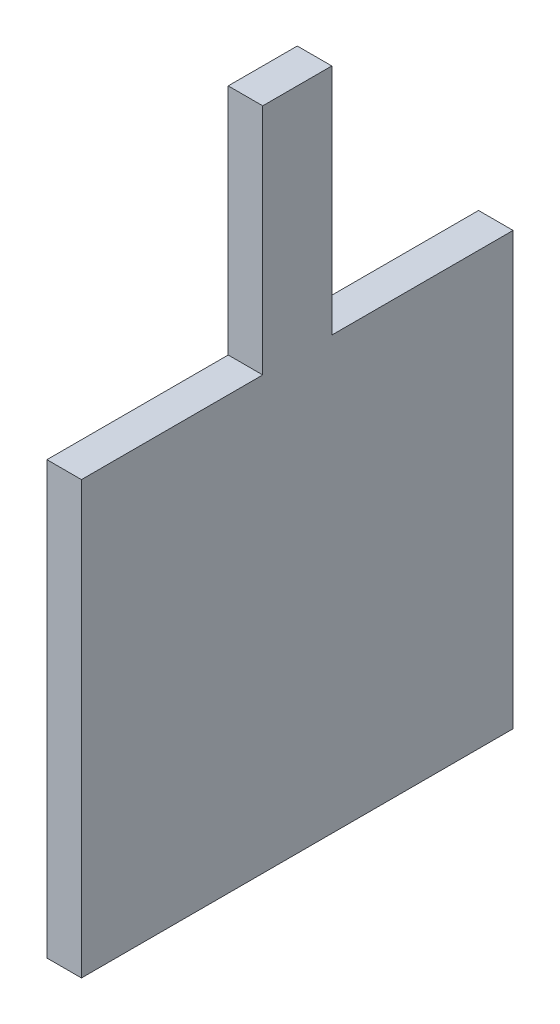
ISO-10303-21;
HEADER;
FILE_DESCRIPTION(('STEP AP214'),'2;1');
FILE_NAME('part.step','',(''),(''),'','','');
FILE_SCHEMA(('AUTOMOTIVE_DESIGN { 1 0 10303 214 1 1 1 1 }'));
ENDSEC;
DATA;
#1=APPLICATION_CONTEXT('core data for automotive mechanical design processes');
#2=APPLICATION_PROTOCOL_DEFINITION('international standard','automotive_design',2000,#1);
#3=PRODUCT_CONTEXT('',#1,'mechanical');
#4=PRODUCT('Part','Part','',(#3));
#5=PRODUCT_RELATED_PRODUCT_CATEGORY('part','',(#4));
#6=PRODUCT_DEFINITION_FORMATION('','',#4);
#7=PRODUCT_DEFINITION_CONTEXT('part definition',#1,'design');
#8=PRODUCT_DEFINITION('design','',#6,#7);
#9=PRODUCT_DEFINITION_SHAPE('','',#8);
#10=(LENGTH_UNIT() NAMED_UNIT(*) SI_UNIT(.MILLI.,.METRE.));
#11=(NAMED_UNIT(*) PLANE_ANGLE_UNIT() SI_UNIT($,.RADIAN.));
#12=(NAMED_UNIT(*) SI_UNIT($,.STERADIAN.) SOLID_ANGLE_UNIT());
#13=UNCERTAINTY_MEASURE_WITH_UNIT(LENGTH_MEASURE(1.E-05),#10,'distance_accuracy_value','');
#14=(GEOMETRIC_REPRESENTATION_CONTEXT(3) GLOBAL_UNCERTAINTY_ASSIGNED_CONTEXT((#13)) GLOBAL_UNIT_ASSIGNED_CONTEXT((#10,
#11,#12)) REPRESENTATION_CONTEXT('',''));
#15=CARTESIAN_POINT('',(0.,0.,0.));
#16=DIRECTION('',(0.,0.,1.));
#17=DIRECTION('',(1.,0.,0.));
#18=AXIS2_PLACEMENT_3D('',#15,#16,#17);
#19=CARTESIAN_POINT('',(4.,0.,21.));
#20=DIRECTION('',(0.,-1.,0.));
#21=DIRECTION('',(0.,0.,-1.));
#22=AXIS2_PLACEMENT_3D('',#19,#20,#21);
#23=PLANE('',#22);
#24=DIRECTION('',(0.,0.,1.));
#25=VECTOR('',#24,1.);
#26=CARTESIAN_POINT('',(0.,0.,21.));
#27=LINE('',#26,#25);
#28=CARTESIAN_POINT('',(0.,0.,0.));
#29=VERTEX_POINT('',#28);
#30=CARTESIAN_POINT('',(0.,0.,21.));
#31=VERTEX_POINT('',#30);
#32=EDGE_CURVE('E129',#29,#31,#27,.T.);
#33=ORIENTED_EDGE('',*,*,#32,.T.);
#34=DIRECTION('',(-1.,0.,0.));
#35=VECTOR('',#34,1.);
#36=CARTESIAN_POINT('',(4.,0.,21.));
#37=LINE('',#36,#35);
#38=CARTESIAN_POINT('',(4.,0.,21.));
#39=VERTEX_POINT('',#38);
#40=EDGE_CURVE('E11',#39,#31,#37,.T.);
#41=ORIENTED_EDGE('',*,*,#40,.F.);
#42=DIRECTION('',(0.,0.,1.));
#43=VECTOR('',#42,1.);
#44=CARTESIAN_POINT('',(4.,0.,21.));
#45=LINE('',#44,#43);
#46=CARTESIAN_POINT('',(4.,0.,0.));
#47=VERTEX_POINT('',#46);
#48=EDGE_CURVE('E143',#47,#39,#45,.T.);
#49=ORIENTED_EDGE('',*,*,#48,.F.);
#50=DIRECTION('',(-1.,0.,0.));
#51=VECTOR('',#50,1.);
#52=CARTESIAN_POINT('',(4.,0.,0.));
#53=LINE('',#52,#51);
#54=EDGE_CURVE('E125',#47,#29,#53,.T.);
#55=ORIENTED_EDGE('',*,*,#54,.T.);
#56=EDGE_LOOP('',(#33,#41,#49,#55));
#57=FACE_BOUND('',#56,.T.);
#58=ADVANCED_FACE('F33',(#57),#23,.F.);
#59=CARTESIAN_POINT('',(4.,-50.,21.));
#60=DIRECTION('',(0.,0.,-1.));
#61=DIRECTION('',(-1.,0.,0.));
#62=AXIS2_PLACEMENT_3D('',#59,#60,#61);
#63=PLANE('',#62);
#64=DIRECTION('',(0.,-1.,0.));
#65=VECTOR('',#64,1.);
#66=CARTESIAN_POINT('',(0.,-50.,21.));
#67=LINE('',#66,#65);
#68=CARTESIAN_POINT('',(0.,-50.,21.));
#69=VERTEX_POINT('',#68);
#70=EDGE_CURVE('E132',#31,#69,#67,.T.);
#71=ORIENTED_EDGE('',*,*,#70,.T.);
#72=DIRECTION('',(-1.,0.,0.));
#73=VECTOR('',#72,1.);
#74=CARTESIAN_POINT('',(4.,-50.,21.));
#75=LINE('',#74,#73);
#76=CARTESIAN_POINT('',(4.,-50.,21.));
#77=VERTEX_POINT('',#76);
#78=EDGE_CURVE('E41',#77,#69,#75,.T.);
#79=ORIENTED_EDGE('',*,*,#78,.F.);
#80=DIRECTION('',(0.,-1.,0.));
#81=VECTOR('',#80,1.);
#82=CARTESIAN_POINT('',(4.,-50.,21.));
#83=LINE('',#82,#81);
#84=EDGE_CURVE('E92',#39,#77,#83,.T.);
#85=ORIENTED_EDGE('',*,*,#84,.F.);
#86=ORIENTED_EDGE('',*,*,#40,.T.);
#87=EDGE_LOOP('',(#71,#79,#85,#86));
#88=FACE_BOUND('',#87,.T.);
#89=ADVANCED_FACE('F178',(#88),#63,.F.);
#90=CARTESIAN_POINT('',(4.,-50.,-29.));
#91=DIRECTION('',(0.,1.,0.));
#92=DIRECTION('',(0.,0.,1.));
#93=AXIS2_PLACEMENT_3D('',#90,#91,#92);
#94=PLANE('',#93);
#95=DIRECTION('',(0.,0.,-1.));
#96=VECTOR('',#95,1.);
#97=CARTESIAN_POINT('',(0.,-50.,-29.));
#98=LINE('',#97,#96);
#99=CARTESIAN_POINT('',(0.,-50.,-29.));
#100=VERTEX_POINT('',#99);
#101=EDGE_CURVE('E134',#69,#100,#98,.T.);
#102=ORIENTED_EDGE('',*,*,#101,.T.);
#103=DIRECTION('',(-1.,0.,0.));
#104=VECTOR('',#103,1.);
#105=CARTESIAN_POINT('',(4.,-50.,-29.));
#106=LINE('',#105,#104);
#107=CARTESIAN_POINT('',(4.,-50.,-29.));
#108=VERTEX_POINT('',#107);
#109=EDGE_CURVE('E150',#108,#100,#106,.T.);
#110=ORIENTED_EDGE('',*,*,#109,.F.);
#111=DIRECTION('',(0.,0.,-1.));
#112=VECTOR('',#111,1.);
#113=CARTESIAN_POINT('',(4.,-50.,-29.));
#114=LINE('',#113,#112);
#115=EDGE_CURVE('E158',#77,#108,#114,.T.);
#116=ORIENTED_EDGE('',*,*,#115,.F.);
#117=ORIENTED_EDGE('',*,*,#78,.T.);
#118=EDGE_LOOP('',(#102,#110,#116,#117));
#119=FACE_BOUND('',#118,.T.);
#120=ADVANCED_FACE('F156',(#119),#94,.F.);
#121=CARTESIAN_POINT('',(4.,0.,-29.));
#122=DIRECTION('',(0.,0.,1.));
#123=DIRECTION('',(0.,-1.,0.));
#124=AXIS2_PLACEMENT_3D('',#121,#122,#123);
#125=PLANE('',#124);
#126=DIRECTION('',(0.,1.,0.));
#127=VECTOR('',#126,1.);
#128=CARTESIAN_POINT('',(0.,0.,-29.));
#129=LINE('',#128,#127);
#130=CARTESIAN_POINT('',(0.,0.,-29.));
#131=VERTEX_POINT('',#130);
#132=EDGE_CURVE('E136',#100,#131,#129,.T.);
#133=ORIENTED_EDGE('',*,*,#132,.T.);
#134=DIRECTION('',(-1.,0.,0.));
#135=VECTOR('',#134,1.);
#136=CARTESIAN_POINT('',(4.,0.,-29.));
#137=LINE('',#136,#135);
#138=CARTESIAN_POINT('',(4.,0.,-29.));
#139=VERTEX_POINT('',#138);
#140=EDGE_CURVE('E147',#139,#131,#137,.T.);
#141=ORIENTED_EDGE('',*,*,#140,.F.);
#142=DIRECTION('',(0.,1.,0.));
#143=VECTOR('',#142,1.);
#144=CARTESIAN_POINT('',(4.,0.,-29.));
#145=LINE('',#144,#143);
#146=EDGE_CURVE('E170',#108,#139,#145,.T.);
#147=ORIENTED_EDGE('',*,*,#146,.F.);
#148=ORIENTED_EDGE('',*,*,#109,.T.);
#149=EDGE_LOOP('',(#133,#141,#147,#148));
#150=FACE_BOUND('',#149,.T.);
#151=ADVANCED_FACE('F166',(#150),#125,.F.);
#152=CARTESIAN_POINT('',(4.,0.,-8.));
#153=DIRECTION('',(0.,-1.,0.));
#154=DIRECTION('',(0.,0.,-1.));
#155=AXIS2_PLACEMENT_3D('',#152,#153,#154);
#156=PLANE('',#155);
#157=DIRECTION('',(0.,0.,1.));
#158=VECTOR('',#157,1.);
#159=CARTESIAN_POINT('',(0.,0.,-8.));
#160=LINE('',#159,#158);
#161=CARTESIAN_POINT('',(0.,0.,-8.));
#162=VERTEX_POINT('',#161);
#163=EDGE_CURVE('E138',#131,#162,#160,.T.);
#164=ORIENTED_EDGE('',*,*,#163,.T.);
#165=DIRECTION('',(-1.,0.,0.));
#166=VECTOR('',#165,1.);
#167=CARTESIAN_POINT('',(4.,0.,-8.));
#168=LINE('',#167,#166);
#169=CARTESIAN_POINT('',(4.,0.,-8.));
#170=VERTEX_POINT('',#169);
#171=EDGE_CURVE('E120',#170,#162,#168,.T.);
#172=ORIENTED_EDGE('',*,*,#171,.F.);
#173=DIRECTION('',(0.,0.,1.));
#174=VECTOR('',#173,1.);
#175=CARTESIAN_POINT('',(4.,0.,-8.));
#176=LINE('',#175,#174);
#177=EDGE_CURVE('E111',#139,#170,#176,.T.);
#178=ORIENTED_EDGE('',*,*,#177,.F.);
#179=ORIENTED_EDGE('',*,*,#140,.T.);
#180=EDGE_LOOP('',(#164,#172,#178,#179));
#181=FACE_BOUND('',#180,.T.);
#182=ADVANCED_FACE('F169',(#181),#156,.F.);
#183=CARTESIAN_POINT('',(4.,27.,-8.));
#184=DIRECTION('',(0.,0.,1.));
#185=DIRECTION('',(0.,-1.,0.));
#186=AXIS2_PLACEMENT_3D('',#183,#184,#185);
#187=PLANE('',#186);
#188=DIRECTION('',(0.,1.,0.));
#189=VECTOR('',#188,1.);
#190=CARTESIAN_POINT('',(0.,27.,-8.));
#191=LINE('',#190,#189);
#192=CARTESIAN_POINT('',(0.,27.,-8.));
#193=VERTEX_POINT('',#192);
#194=EDGE_CURVE('E119',#162,#193,#191,.T.);
#195=ORIENTED_EDGE('',*,*,#194,.T.);
#196=DIRECTION('',(-1.,0.,0.));
#197=VECTOR('',#196,1.);
#198=CARTESIAN_POINT('',(4.,27.,-8.));
#199=LINE('',#198,#197);
#200=CARTESIAN_POINT('',(4.,27.,-8.));
#201=VERTEX_POINT('',#200);
#202=EDGE_CURVE('E116',#201,#193,#199,.T.);
#203=ORIENTED_EDGE('',*,*,#202,.F.);
#204=DIRECTION('',(0.,1.,0.));
#205=VECTOR('',#204,1.);
#206=CARTESIAN_POINT('',(4.,27.,-8.));
#207=LINE('',#206,#205);
#208=EDGE_CURVE('E105',#170,#201,#207,.T.);
#209=ORIENTED_EDGE('',*,*,#208,.F.);
#210=ORIENTED_EDGE('',*,*,#171,.T.);
#211=EDGE_LOOP('',(#195,#203,#209,#210));
#212=FACE_BOUND('',#211,.T.);
#213=ADVANCED_FACE('F117',(#212),#187,.F.);
#214=CARTESIAN_POINT('',(4.,27.,0.));
#215=DIRECTION('',(0.,-1.,0.));
#216=DIRECTION('',(0.,0.,-1.));
#217=AXIS2_PLACEMENT_3D('',#214,#215,#216);
#218=PLANE('',#217);
#219=DIRECTION('',(0.,0.,1.));
#220=VECTOR('',#219,1.);
#221=CARTESIAN_POINT('',(0.,27.,0.));
#222=LINE('',#221,#220);
#223=CARTESIAN_POINT('',(0.,27.,0.));
#224=VERTEX_POINT('',#223);
#225=EDGE_CURVE('E78',#193,#224,#222,.T.);
#226=ORIENTED_EDGE('',*,*,#225,.T.);
#227=DIRECTION('',(-1.,0.,0.));
#228=VECTOR('',#227,1.);
#229=CARTESIAN_POINT('',(4.,27.,0.));
#230=LINE('',#229,#228);
#231=CARTESIAN_POINT('',(4.,27.,0.));
#232=VERTEX_POINT('',#231);
#233=EDGE_CURVE('E121',#232,#224,#230,.T.);
#234=ORIENTED_EDGE('',*,*,#233,.F.);
#235=DIRECTION('',(0.,0.,1.));
#236=VECTOR('',#235,1.);
#237=CARTESIAN_POINT('',(4.,27.,0.));
#238=LINE('',#237,#236);
#239=EDGE_CURVE('E109',#201,#232,#238,.T.);
#240=ORIENTED_EDGE('',*,*,#239,.F.);
#241=ORIENTED_EDGE('',*,*,#202,.T.);
#242=EDGE_LOOP('',(#226,#234,#240,#241));
#243=FACE_BOUND('',#242,.T.);
#244=ADVANCED_FACE('F123',(#243),#218,.F.);
#245=CARTESIAN_POINT('',(4.,0.,0.));
#246=DIRECTION('',(0.,0.,-1.));
#247=DIRECTION('',(-1.,0.,0.));
#248=AXIS2_PLACEMENT_3D('',#245,#246,#247);
#249=PLANE('',#248);
#250=DIRECTION('',(0.,-1.,0.));
#251=VECTOR('',#250,1.);
#252=CARTESIAN_POINT('',(0.,0.,0.));
#253=LINE('',#252,#251);
#254=EDGE_CURVE('E84',#224,#29,#253,.T.);
#255=ORIENTED_EDGE('',*,*,#254,.T.);
#256=ORIENTED_EDGE('',*,*,#54,.F.);
#257=DIRECTION('',(0.,-1.,0.));
#258=VECTOR('',#257,1.);
#259=CARTESIAN_POINT('',(4.,0.,0.));
#260=LINE('',#259,#258);
#261=EDGE_CURVE('E49',#232,#47,#260,.T.);
#262=ORIENTED_EDGE('',*,*,#261,.F.);
#263=ORIENTED_EDGE('',*,*,#233,.T.);
#264=EDGE_LOOP('',(#255,#256,#262,#263));
#265=FACE_BOUND('',#264,.T.);
#266=ADVANCED_FACE('F194',(#265),#249,.F.);
#267=CARTESIAN_POINT('',(4.,0.,0.));
#268=DIRECTION('',(1.,0.,0.));
#269=DIRECTION('',(0.,0.,-1.));
#270=AXIS2_PLACEMENT_3D('',#267,#268,#269);
#271=PLANE('',#270);
#272=ORIENTED_EDGE('',*,*,#48,.T.);
#273=ORIENTED_EDGE('',*,*,#84,.T.);
#274=ORIENTED_EDGE('',*,*,#115,.T.);
#275=ORIENTED_EDGE('',*,*,#146,.T.);
#276=ORIENTED_EDGE('',*,*,#177,.T.);
#277=ORIENTED_EDGE('',*,*,#208,.T.);
#278=ORIENTED_EDGE('',*,*,#239,.T.);
#279=ORIENTED_EDGE('',*,*,#261,.T.);
#280=EDGE_LOOP('',(#272,#273,#274,#275,#276,#277,#278,#279));
#281=FACE_BOUND('',#280,.T.);
#282=ADVANCED_FACE('F107',(#281),#271,.T.);
#283=CARTESIAN_POINT('',(0.,0.,0.));
#284=DIRECTION('',(1.,0.,0.));
#285=DIRECTION('',(0.,0.,-1.));
#286=AXIS2_PLACEMENT_3D('',#283,#284,#285);
#287=PLANE('',#286);
#288=ORIENTED_EDGE('',*,*,#32,.F.);
#289=ORIENTED_EDGE('',*,*,#254,.F.);
#290=ORIENTED_EDGE('',*,*,#225,.F.);
#291=ORIENTED_EDGE('',*,*,#194,.F.);
#292=ORIENTED_EDGE('',*,*,#163,.F.);
#293=ORIENTED_EDGE('',*,*,#132,.F.);
#294=ORIENTED_EDGE('',*,*,#101,.F.);
#295=ORIENTED_EDGE('',*,*,#70,.F.);
#296=EDGE_LOOP('',(#288,#289,#290,#291,#292,#293,#294,#295));
#297=FACE_BOUND('',#296,.T.);
#298=ADVANCED_FACE('F162',(#297),#287,.F.);
#299=CLOSED_SHELL('',(#58,#89,#120,#151,#182,#213,#244,#266,#282,#298));
#300=MANIFOLD_SOLID_BREP('B2',#299);
#301=ADVANCED_BREP_SHAPE_REPRESENTATION('',(#18,#300),#14);
#302=SHAPE_DEFINITION_REPRESENTATION(#9,#301);
ENDSEC;
END-ISO-10303-21;
